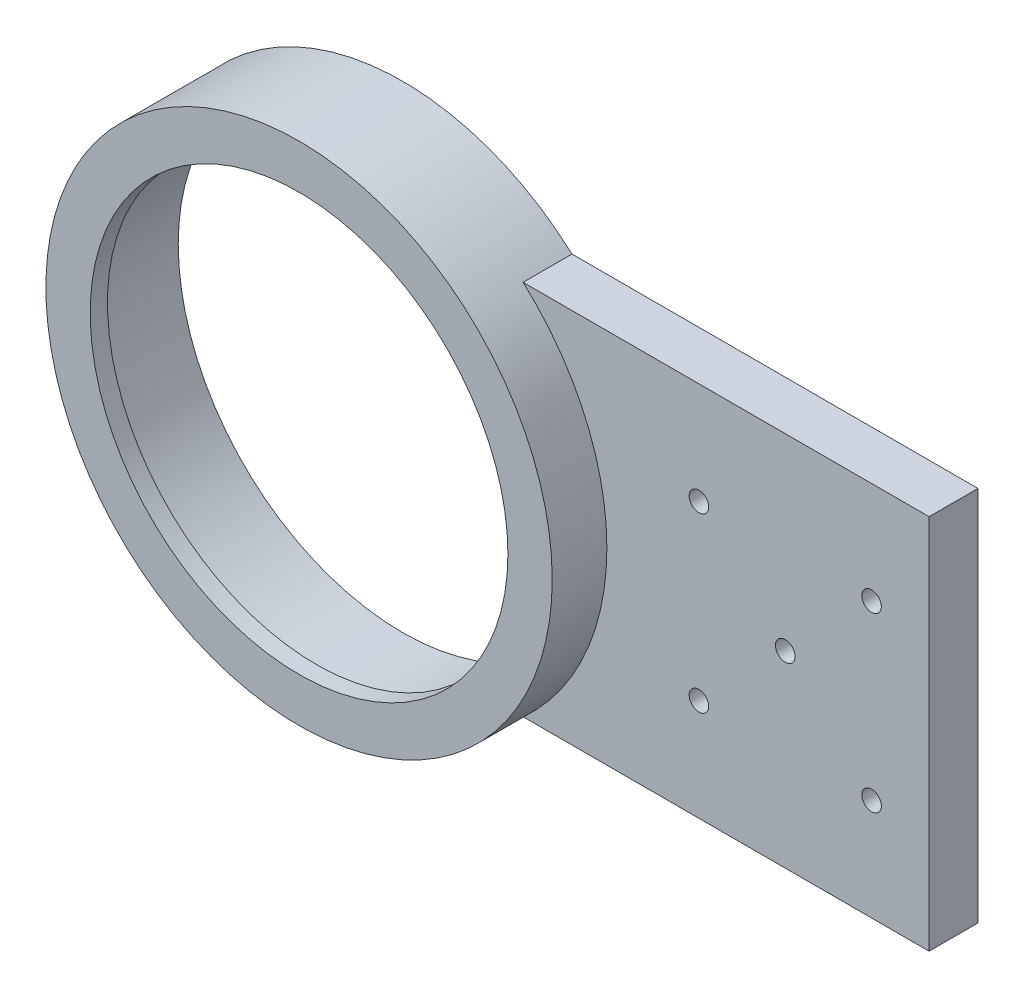
ISO-10303-21;
HEADER;
FILE_DESCRIPTION(('STEP AP214'),'2;1');
FILE_NAME('part.step','',(''),(''),'','','');
FILE_SCHEMA(('AUTOMOTIVE_DESIGN { 1 0 10303 214 1 1 1 1 }'));
ENDSEC;
DATA;
#1=APPLICATION_CONTEXT('core data for automotive mechanical design processes');
#2=APPLICATION_PROTOCOL_DEFINITION('international standard','automotive_design',2000,#1);
#3=PRODUCT_CONTEXT('',#1,'mechanical');
#4=PRODUCT('Part','Part','',(#3));
#5=PRODUCT_RELATED_PRODUCT_CATEGORY('part','',(#4));
#6=PRODUCT_DEFINITION_FORMATION('','',#4);
#7=PRODUCT_DEFINITION_CONTEXT('part definition',#1,'design');
#8=PRODUCT_DEFINITION('design','',#6,#7);
#9=PRODUCT_DEFINITION_SHAPE('','',#8);
#10=(LENGTH_UNIT() NAMED_UNIT(*) SI_UNIT(.MILLI.,.METRE.));
#11=(NAMED_UNIT(*) PLANE_ANGLE_UNIT() SI_UNIT($,.RADIAN.));
#12=(NAMED_UNIT(*) SI_UNIT($,.STERADIAN.) SOLID_ANGLE_UNIT());
#13=UNCERTAINTY_MEASURE_WITH_UNIT(LENGTH_MEASURE(1.E-05),#10,'distance_accuracy_value','');
#14=(GEOMETRIC_REPRESENTATION_CONTEXT(3) GLOBAL_UNCERTAINTY_ASSIGNED_CONTEXT((#13)) GLOBAL_UNIT_ASSIGNED_CONTEXT((#10,
#11,#12)) REPRESENTATION_CONTEXT('',''));
#15=CARTESIAN_POINT('',(0.,0.,0.));
#16=DIRECTION('',(0.,0.,1.));
#17=DIRECTION('',(1.,0.,0.));
#18=AXIS2_PLACEMENT_3D('',#15,#16,#17);
#19=CARTESIAN_POINT('',(0.,0.,0.));
#20=DIRECTION('',(0.,0.,1.));
#21=DIRECTION('',(1.,0.,0.));
#22=AXIS2_PLACEMENT_3D('',#19,#20,#21);
#23=PLANE('',#22);
#24=CARTESIAN_POINT('',(0.,0.,0.));
#25=DIRECTION('',(0.,0.,1.));
#26=DIRECTION('',(1.,0.,0.));
#27=AXIS2_PLACEMENT_3D('',#24,#25,#26);
#28=CIRCLE('',#27,36.3);
#29=CARTESIAN_POINT('',(36.3,0.,0.));
#30=VERTEX_POINT('',#29);
#31=EDGE_CURVE('E116',#30,#30,#28,.T.);
#32=ORIENTED_EDGE('',*,*,#31,.T.);
#33=EDGE_LOOP('',(#32));
#34=FACE_BOUND('',#33,.T.);
#35=CARTESIAN_POINT('',(0.,0.,0.));
#36=DIRECTION('',(0.,0.,-1.));
#37=DIRECTION('',(-1.,0.,0.));
#38=AXIS2_PLACEMENT_3D('',#35,#36,#37);
#39=CIRCLE('',#38,39.);
#40=CARTESIAN_POINT('',(-39.,0.,0.));
#41=VERTEX_POINT('',#40);
#42=EDGE_CURVE('E106',#41,#41,#39,.T.);
#43=ORIENTED_EDGE('',*,*,#42,.T.);
#44=EDGE_LOOP('',(#43));
#45=FACE_BOUND('',#44,.T.);
#46=ADVANCED_FACE('F32',(#34,#45),#23,.F.);
#47=CARTESIAN_POINT('',(0.,0.,3.));
#48=DIRECTION('',(0.,0.,1.));
#49=DIRECTION('',(1.,0.,0.));
#50=AXIS2_PLACEMENT_3D('',#47,#48,#49);
#51=PLANE('',#50);
#52=CARTESIAN_POINT('',(0.,0.,3.));
#53=DIRECTION('',(0.,0.,1.));
#54=DIRECTION('',(1.,0.,0.));
#55=AXIS2_PLACEMENT_3D('',#52,#53,#54);
#56=CIRCLE('',#55,44.);
#57=CARTESIAN_POINT('',(44.,0.,3.));
#58=VERTEX_POINT('',#57);
#59=EDGE_CURVE('E11',#58,#58,#56,.T.);
#60=ORIENTED_EDGE('',*,*,#59,.T.);
#61=EDGE_LOOP('',(#60));
#62=FACE_BOUND('',#61,.T.);
#63=CARTESIAN_POINT('',(0.,0.,3.));
#64=DIRECTION('',(0.,0.,1.));
#65=DIRECTION('',(1.,0.,0.));
#66=AXIS2_PLACEMENT_3D('',#63,#64,#65);
#67=CIRCLE('',#66,36.3);
#68=CARTESIAN_POINT('',(36.3,0.,3.));
#69=VERTEX_POINT('',#68);
#70=EDGE_CURVE('E40',#69,#69,#67,.T.);
#71=ORIENTED_EDGE('',*,*,#70,.F.);
#72=EDGE_LOOP('',(#71));
#73=FACE_BOUND('',#72,.T.);
#74=ADVANCED_FACE('F135',(#62,#73),#51,.T.);
#75=CARTESIAN_POINT('',(0.,0.,3.));
#76=DIRECTION('',(0.,0.,-1.));
#77=DIRECTION('',(-1.,0.,0.));
#78=AXIS2_PLACEMENT_3D('',#75,#76,#77);
#79=CYLINDRICAL_SURFACE('',#78,44.);
#80=CARTESIAN_POINT('',(0.,0.,-15.));
#81=DIRECTION('',(0.,0.,-1.));
#82=DIRECTION('',(-1.,0.,0.));
#83=AXIS2_PLACEMENT_3D('',#80,#81,#82);
#84=CIRCLE('',#83,44.);
#85=CARTESIAN_POINT('',(29.4399388586322,-32.7,-15.));
#86=VERTEX_POINT('',#85);
#87=CARTESIAN_POINT('',(29.4399388586322,32.7,-15.));
#88=VERTEX_POINT('',#87);
#89=EDGE_CURVE('E112',#86,#88,#84,.T.);
#90=ORIENTED_EDGE('',*,*,#89,.F.);
#91=DIRECTION('',(0.,0.,-1.));
#92=VECTOR('',#91,1.);
#93=CARTESIAN_POINT('',(29.4399388586322,-32.7,-6.5));
#94=LINE('',#93,#92);
#95=CARTESIAN_POINT('',(29.4399388586322,-32.7,-6.5));
#96=VERTEX_POINT('',#95);
#97=EDGE_CURVE('E104',#96,#86,#94,.T.);
#98=ORIENTED_EDGE('',*,*,#97,.F.);
#99=CARTESIAN_POINT('',(0.,0.,-6.5));
#100=DIRECTION('',(0.,0.,1.));
#101=DIRECTION('',(-1.,0.,0.));
#102=AXIS2_PLACEMENT_3D('',#99,#100,#101);
#103=CIRCLE('',#102,44.);
#104=CARTESIAN_POINT('',(29.4399388586322,32.7,-6.5));
#105=VERTEX_POINT('',#104);
#106=EDGE_CURVE('E56',#96,#105,#103,.T.);
#107=ORIENTED_EDGE('',*,*,#106,.T.);
#108=DIRECTION('',(0.,0.,-1.));
#109=VECTOR('',#108,1.);
#110=CARTESIAN_POINT('',(29.4399388586322,32.7,-6.5));
#111=LINE('',#110,#109);
#112=EDGE_CURVE('E80',#105,#88,#111,.T.);
#113=ORIENTED_EDGE('',*,*,#112,.T.);
#114=EDGE_LOOP('',(#90,#98,#107,#113));
#115=FACE_BOUND('',#114,.T.);
#116=ORIENTED_EDGE('',*,*,#59,.F.);
#117=EDGE_LOOP('',(#116));
#118=FACE_BOUND('',#117,.T.);
#119=ADVANCED_FACE('F34',(#115,#118),#79,.T.);
#120=CARTESIAN_POINT('',(0.,0.,3.));
#121=DIRECTION('',(0.,0.,-1.));
#122=DIRECTION('',(-1.,0.,0.));
#123=AXIS2_PLACEMENT_3D('',#120,#121,#122);
#124=CYLINDRICAL_SURFACE('',#123,36.3);
#125=ORIENTED_EDGE('',*,*,#70,.T.);
#126=EDGE_LOOP('',(#125));
#127=FACE_BOUND('',#126,.T.);
#128=ORIENTED_EDGE('',*,*,#31,.F.);
#129=EDGE_LOOP('',(#128));
#130=FACE_BOUND('',#129,.T.);
#131=ADVANCED_FACE('F123',(#127,#130),#124,.F.);
#132=CARTESIAN_POINT('',(0.,0.,-15.));
#133=DIRECTION('',(0.,0.,-1.));
#134=DIRECTION('',(-1.,0.,0.));
#135=AXIS2_PLACEMENT_3D('',#132,#133,#134);
#136=PLANE('',#135);
#137=CARTESIAN_POINT('',(75.,0.,-15.));
#138=DIRECTION('',(0.,0.,-1.));
#139=DIRECTION('',(-1.,0.,0.));
#140=AXIS2_PLACEMENT_3D('',#137,#138,#139);
#141=CIRCLE('',#140,1.69999999999999);
#142=CARTESIAN_POINT('',(73.3,0.,-15.));
#143=VERTEX_POINT('',#142);
#144=EDGE_CURVE('E268',#143,#143,#141,.T.);
#145=ORIENTED_EDGE('',*,*,#144,.F.);
#146=EDGE_LOOP('',(#145));
#147=FACE_BOUND('',#146,.T.);
#148=CARTESIAN_POINT('',(90.,15.,-15.));
#149=DIRECTION('',(0.,0.,-1.));
#150=DIRECTION('',(-1.,0.,0.));
#151=AXIS2_PLACEMENT_3D('',#148,#149,#150);
#152=CIRCLE('',#151,1.69999999999999);
#153=CARTESIAN_POINT('',(88.3,15.,-15.));
#154=VERTEX_POINT('',#153);
#155=EDGE_CURVE('E270',#154,#154,#152,.T.);
#156=ORIENTED_EDGE('',*,*,#155,.F.);
#157=EDGE_LOOP('',(#156));
#158=FACE_BOUND('',#157,.T.);
#159=CARTESIAN_POINT('',(60.,-15.,-15.));
#160=DIRECTION('',(0.,0.,-1.));
#161=DIRECTION('',(-1.,0.,0.));
#162=AXIS2_PLACEMENT_3D('',#159,#160,#161);
#163=CIRCLE('',#162,1.69999999999999);
#164=CARTESIAN_POINT('',(58.3,-15.,-15.));
#165=VERTEX_POINT('',#164);
#166=EDGE_CURVE('E278',#165,#165,#163,.T.);
#167=ORIENTED_EDGE('',*,*,#166,.F.);
#168=EDGE_LOOP('',(#167));
#169=FACE_BOUND('',#168,.T.);
#170=CARTESIAN_POINT('',(60.,15.,-15.));
#171=DIRECTION('',(0.,0.,-1.));
#172=DIRECTION('',(-1.,0.,0.));
#173=AXIS2_PLACEMENT_3D('',#170,#171,#172);
#174=CIRCLE('',#173,1.69999999999999);
#175=CARTESIAN_POINT('',(58.3,15.,-15.));
#176=VERTEX_POINT('',#175);
#177=EDGE_CURVE('E284',#176,#176,#174,.T.);
#178=ORIENTED_EDGE('',*,*,#177,.F.);
#179=EDGE_LOOP('',(#178));
#180=FACE_BOUND('',#179,.T.);
#181=CARTESIAN_POINT('',(90.,-15.,-15.));
#182=DIRECTION('',(0.,0.,-1.));
#183=DIRECTION('',(-1.,0.,0.));
#184=AXIS2_PLACEMENT_3D('',#181,#182,#183);
#185=CIRCLE('',#184,1.69999999999999);
#186=CARTESIAN_POINT('',(88.3,-15.,-15.));
#187=VERTEX_POINT('',#186);
#188=EDGE_CURVE('E290',#187,#187,#185,.T.);
#189=ORIENTED_EDGE('',*,*,#188,.F.);
#190=EDGE_LOOP('',(#189));
#191=FACE_BOUND('',#190,.T.);
#192=ORIENTED_EDGE('',*,*,#89,.T.);
#193=DIRECTION('',(1.,0.,0.));
#194=VECTOR('',#193,1.);
#195=CARTESIAN_POINT('',(29.4399388586322,32.7,-15.));
#196=LINE('',#195,#194);
#197=CARTESIAN_POINT('',(100.,32.7,-15.));
#198=VERTEX_POINT('',#197);
#199=EDGE_CURVE('E99',#88,#198,#196,.T.);
#200=ORIENTED_EDGE('',*,*,#199,.T.);
#201=DIRECTION('',(0.,-1.,0.));
#202=VECTOR('',#201,1.);
#203=CARTESIAN_POINT('',(100.,32.7,-15.));
#204=LINE('',#203,#202);
#205=CARTESIAN_POINT('',(100.,-32.7,-15.));
#206=VERTEX_POINT('',#205);
#207=EDGE_CURVE('E86',#198,#206,#204,.T.);
#208=ORIENTED_EDGE('',*,*,#207,.T.);
#209=DIRECTION('',(-1.,0.,0.));
#210=VECTOR('',#209,1.);
#211=CARTESIAN_POINT('',(100.,-32.7,-15.));
#212=LINE('',#211,#210);
#213=EDGE_CURVE('E47',#206,#86,#212,.T.);
#214=ORIENTED_EDGE('',*,*,#213,.T.);
#215=EDGE_LOOP('',(#192,#200,#208,#214));
#216=FACE_BOUND('',#215,.T.);
#217=CARTESIAN_POINT('',(0.,0.,-15.));
#218=DIRECTION('',(0.,0.,-1.));
#219=DIRECTION('',(-1.,0.,0.));
#220=AXIS2_PLACEMENT_3D('',#217,#218,#219);
#221=CIRCLE('',#220,39.);
#222=CARTESIAN_POINT('',(-39.,0.,-15.));
#223=VERTEX_POINT('',#222);
#224=EDGE_CURVE('E109',#223,#223,#221,.T.);
#225=ORIENTED_EDGE('',*,*,#224,.F.);
#226=EDGE_LOOP('',(#225));
#227=FACE_BOUND('',#226,.T.);
#228=ADVANCED_FACE('F125',(#147,#158,#169,#180,#191,#216,#227),#136,.T.);
#229=CARTESIAN_POINT('',(0.,0.,-15.));
#230=DIRECTION('',(0.,0.,1.));
#231=DIRECTION('',(1.,0.,0.));
#232=AXIS2_PLACEMENT_3D('',#229,#230,#231);
#233=CYLINDRICAL_SURFACE('',#232,39.);
#234=ORIENTED_EDGE('',*,*,#224,.T.);
#235=EDGE_LOOP('',(#234));
#236=FACE_BOUND('',#235,.T.);
#237=ORIENTED_EDGE('',*,*,#42,.F.);
#238=EDGE_LOOP('',(#237));
#239=FACE_BOUND('',#238,.T.);
#240=ADVANCED_FACE('F132',(#236,#239),#233,.F.);
#241=CARTESIAN_POINT('',(100.,-32.7,-6.5));
#242=DIRECTION('',(0.,-1.,0.));
#243=DIRECTION('',(0.,0.,-1.));
#244=AXIS2_PLACEMENT_3D('',#241,#242,#243);
#245=PLANE('',#244);
#246=ORIENTED_EDGE('',*,*,#213,.F.);
#247=DIRECTION('',(0.,0.,-1.));
#248=VECTOR('',#247,1.);
#249=CARTESIAN_POINT('',(100.,-32.7,-6.5));
#250=LINE('',#249,#248);
#251=CARTESIAN_POINT('',(100.,-32.7,-6.5));
#252=VERTEX_POINT('',#251);
#253=EDGE_CURVE('E74',#252,#206,#250,.T.);
#254=ORIENTED_EDGE('',*,*,#253,.F.);
#255=DIRECTION('',(-1.,0.,0.));
#256=VECTOR('',#255,1.);
#257=CARTESIAN_POINT('',(100.,-32.7,-6.5));
#258=LINE('',#257,#256);
#259=EDGE_CURVE('E91',#252,#96,#258,.T.);
#260=ORIENTED_EDGE('',*,*,#259,.T.);
#261=ORIENTED_EDGE('',*,*,#97,.T.);
#262=EDGE_LOOP('',(#246,#254,#260,#261));
#263=FACE_BOUND('',#262,.T.);
#264=ADVANCED_FACE('F165',(#263),#245,.T.);
#265=CARTESIAN_POINT('',(100.,32.7,-6.5));
#266=DIRECTION('',(1.,0.,0.));
#267=DIRECTION('',(0.,0.,-1.));
#268=AXIS2_PLACEMENT_3D('',#265,#266,#267);
#269=PLANE('',#268);
#270=ORIENTED_EDGE('',*,*,#207,.F.);
#271=DIRECTION('',(0.,0.,-1.));
#272=VECTOR('',#271,1.);
#273=CARTESIAN_POINT('',(100.,32.7,-6.5));
#274=LINE('',#273,#272);
#275=CARTESIAN_POINT('',(100.,32.7,-6.5));
#276=VERTEX_POINT('',#275);
#277=EDGE_CURVE('E82',#276,#198,#274,.T.);
#278=ORIENTED_EDGE('',*,*,#277,.F.);
#279=DIRECTION('',(0.,-1.,0.));
#280=VECTOR('',#279,1.);
#281=CARTESIAN_POINT('',(100.,32.7,-6.5));
#282=LINE('',#281,#280);
#283=EDGE_CURVE('E85',#276,#252,#282,.T.);
#284=ORIENTED_EDGE('',*,*,#283,.T.);
#285=ORIENTED_EDGE('',*,*,#253,.T.);
#286=EDGE_LOOP('',(#270,#278,#284,#285));
#287=FACE_BOUND('',#286,.T.);
#288=ADVANCED_FACE('F84',(#287),#269,.T.);
#289=CARTESIAN_POINT('',(29.4399388586322,32.7,-6.5));
#290=DIRECTION('',(0.,1.,0.));
#291=DIRECTION('',(0.,0.,1.));
#292=AXIS2_PLACEMENT_3D('',#289,#290,#291);
#293=PLANE('',#292);
#294=ORIENTED_EDGE('',*,*,#199,.F.);
#295=ORIENTED_EDGE('',*,*,#112,.F.);
#296=DIRECTION('',(1.,0.,0.));
#297=VECTOR('',#296,1.);
#298=CARTESIAN_POINT('',(29.4399388586322,32.7,-6.5));
#299=LINE('',#298,#297);
#300=EDGE_CURVE('E90',#105,#276,#299,.T.);
#301=ORIENTED_EDGE('',*,*,#300,.T.);
#302=ORIENTED_EDGE('',*,*,#277,.T.);
#303=EDGE_LOOP('',(#294,#295,#301,#302));
#304=FACE_BOUND('',#303,.T.);
#305=ADVANCED_FACE('F93',(#304),#293,.T.);
#306=CARTESIAN_POINT('',(0.,0.,-6.5));
#307=DIRECTION('',(0.,0.,-1.));
#308=DIRECTION('',(-1.,0.,0.));
#309=AXIS2_PLACEMENT_3D('',#306,#307,#308);
#310=PLANE('',#309);
#311=CARTESIAN_POINT('',(75.,0.,-6.5));
#312=DIRECTION('',(0.,0.,-1.));
#313=DIRECTION('',(-1.,0.,0.));
#314=AXIS2_PLACEMENT_3D('',#311,#312,#313);
#315=CIRCLE('',#314,1.69999999999999);
#316=CARTESIAN_POINT('',(73.3,0.,-6.5));
#317=VERTEX_POINT('',#316);
#318=EDGE_CURVE('E265',#317,#317,#315,.T.);
#319=ORIENTED_EDGE('',*,*,#318,.T.);
#320=EDGE_LOOP('',(#319));
#321=FACE_BOUND('',#320,.T.);
#322=CARTESIAN_POINT('',(90.,15.,-6.5));
#323=DIRECTION('',(0.,0.,-1.));
#324=DIRECTION('',(-1.,0.,0.));
#325=AXIS2_PLACEMENT_3D('',#322,#323,#324);
#326=CIRCLE('',#325,1.69999999999999);
#327=CARTESIAN_POINT('',(88.3,15.,-6.5));
#328=VERTEX_POINT('',#327);
#329=EDGE_CURVE('E275',#328,#328,#326,.T.);
#330=ORIENTED_EDGE('',*,*,#329,.T.);
#331=EDGE_LOOP('',(#330));
#332=FACE_BOUND('',#331,.T.);
#333=CARTESIAN_POINT('',(60.,-15.,-6.5));
#334=DIRECTION('',(0.,0.,-1.));
#335=DIRECTION('',(-1.,0.,0.));
#336=AXIS2_PLACEMENT_3D('',#333,#334,#335);
#337=CIRCLE('',#336,1.69999999999999);
#338=CARTESIAN_POINT('',(58.3,-15.,-6.5));
#339=VERTEX_POINT('',#338);
#340=EDGE_CURVE('E281',#339,#339,#337,.T.);
#341=ORIENTED_EDGE('',*,*,#340,.T.);
#342=EDGE_LOOP('',(#341));
#343=FACE_BOUND('',#342,.T.);
#344=CARTESIAN_POINT('',(60.,15.,-6.5));
#345=DIRECTION('',(0.,0.,-1.));
#346=DIRECTION('',(-1.,0.,0.));
#347=AXIS2_PLACEMENT_3D('',#344,#345,#346);
#348=CIRCLE('',#347,1.69999999999999);
#349=CARTESIAN_POINT('',(58.3,15.,-6.5));
#350=VERTEX_POINT('',#349);
#351=EDGE_CURVE('E287',#350,#350,#348,.T.);
#352=ORIENTED_EDGE('',*,*,#351,.T.);
#353=EDGE_LOOP('',(#352));
#354=FACE_BOUND('',#353,.T.);
#355=CARTESIAN_POINT('',(90.,-15.,-6.5));
#356=DIRECTION('',(0.,0.,-1.));
#357=DIRECTION('',(-1.,0.,0.));
#358=AXIS2_PLACEMENT_3D('',#355,#356,#357);
#359=CIRCLE('',#358,1.69999999999999);
#360=CARTESIAN_POINT('',(88.3,-15.,-6.5));
#361=VERTEX_POINT('',#360);
#362=EDGE_CURVE('E101',#361,#361,#359,.T.);
#363=ORIENTED_EDGE('',*,*,#362,.T.);
#364=EDGE_LOOP('',(#363));
#365=FACE_BOUND('',#364,.T.);
#366=ORIENTED_EDGE('',*,*,#106,.F.);
#367=ORIENTED_EDGE('',*,*,#259,.F.);
#368=ORIENTED_EDGE('',*,*,#283,.F.);
#369=ORIENTED_EDGE('',*,*,#300,.F.);
#370=EDGE_LOOP('',(#366,#367,#368,#369));
#371=FACE_BOUND('',#370,.T.);
#372=ADVANCED_FACE('F89',(#321,#332,#343,#354,#365,#371),#310,.F.);
#373=CARTESIAN_POINT('',(90.,-15.,-15.));
#374=DIRECTION('',(0.,0.,-1.));
#375=DIRECTION('',(-1.,0.,0.));
#376=AXIS2_PLACEMENT_3D('',#373,#374,#375);
#377=CYLINDRICAL_SURFACE('',#376,1.69999999999999);
#378=ORIENTED_EDGE('',*,*,#362,.F.);
#379=EDGE_LOOP('',(#378));
#380=FACE_BOUND('',#379,.T.);
#381=ORIENTED_EDGE('',*,*,#188,.T.);
#382=EDGE_LOOP('',(#381));
#383=FACE_BOUND('',#382,.T.);
#384=ADVANCED_FACE('F201',(#380,#383),#377,.F.);
#385=CARTESIAN_POINT('',(60.,15.,-15.));
#386=DIRECTION('',(0.,0.,-1.));
#387=DIRECTION('',(-1.,0.,0.));
#388=AXIS2_PLACEMENT_3D('',#385,#386,#387);
#389=CYLINDRICAL_SURFACE('',#388,1.69999999999999);
#390=ORIENTED_EDGE('',*,*,#351,.F.);
#391=EDGE_LOOP('',(#390));
#392=FACE_BOUND('',#391,.T.);
#393=ORIENTED_EDGE('',*,*,#177,.T.);
#394=EDGE_LOOP('',(#393));
#395=FACE_BOUND('',#394,.T.);
#396=ADVANCED_FACE('F211',(#392,#395),#389,.F.);
#397=CARTESIAN_POINT('',(60.,-15.,-15.));
#398=DIRECTION('',(0.,0.,-1.));
#399=DIRECTION('',(-1.,0.,0.));
#400=AXIS2_PLACEMENT_3D('',#397,#398,#399);
#401=CYLINDRICAL_SURFACE('',#400,1.69999999999999);
#402=ORIENTED_EDGE('',*,*,#340,.F.);
#403=EDGE_LOOP('',(#402));
#404=FACE_BOUND('',#403,.T.);
#405=ORIENTED_EDGE('',*,*,#166,.T.);
#406=EDGE_LOOP('',(#405));
#407=FACE_BOUND('',#406,.T.);
#408=ADVANCED_FACE('F221',(#404,#407),#401,.F.);
#409=CARTESIAN_POINT('',(90.,15.,-15.));
#410=DIRECTION('',(0.,0.,-1.));
#411=DIRECTION('',(-1.,0.,0.));
#412=AXIS2_PLACEMENT_3D('',#409,#410,#411);
#413=CYLINDRICAL_SURFACE('',#412,1.69999999999999);
#414=ORIENTED_EDGE('',*,*,#329,.F.);
#415=EDGE_LOOP('',(#414));
#416=FACE_BOUND('',#415,.T.);
#417=ORIENTED_EDGE('',*,*,#155,.T.);
#418=EDGE_LOOP('',(#417));
#419=FACE_BOUND('',#418,.T.);
#420=ADVANCED_FACE('F231',(#416,#419),#413,.F.);
#421=CARTESIAN_POINT('',(75.,0.,-15.));
#422=DIRECTION('',(0.,0.,-1.));
#423=DIRECTION('',(-1.,0.,0.));
#424=AXIS2_PLACEMENT_3D('',#421,#422,#423);
#425=CYLINDRICAL_SURFACE('',#424,1.69999999999999);
#426=ORIENTED_EDGE('',*,*,#318,.F.);
#427=EDGE_LOOP('',(#426));
#428=FACE_BOUND('',#427,.T.);
#429=ORIENTED_EDGE('',*,*,#144,.T.);
#430=EDGE_LOOP('',(#429));
#431=FACE_BOUND('',#430,.T.);
#432=ADVANCED_FACE('F241',(#428,#431),#425,.F.);
#433=CLOSED_SHELL('',(#46,#74,#119,#131,#228,#240,#264,#288,#305,#372,#384,#396,#408,#420,#432));
#434=MANIFOLD_SOLID_BREP('B2',#433);
#435=ADVANCED_BREP_SHAPE_REPRESENTATION('',(#18,#434),#14);
#436=SHAPE_DEFINITION_REPRESENTATION(#9,#435);
ENDSEC;
END-ISO-10303-21;
